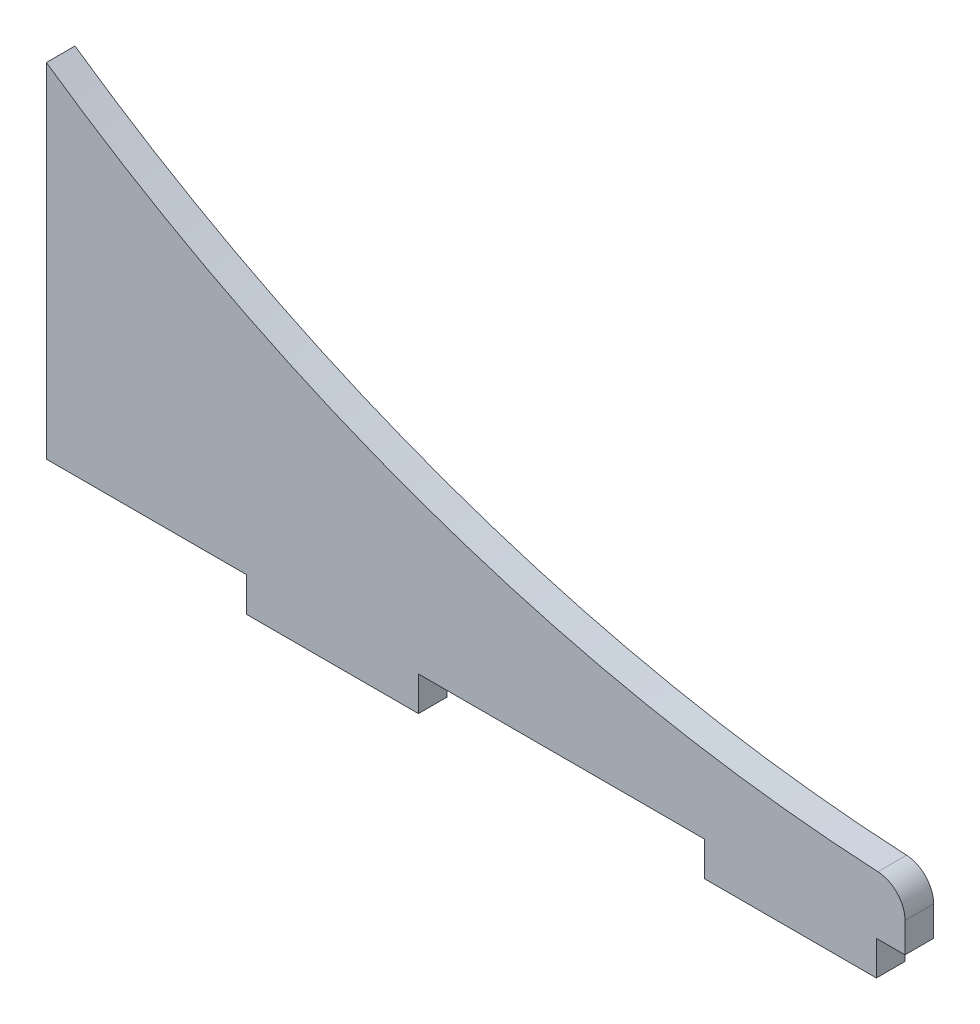
ISO-10303-21;
HEADER;
FILE_DESCRIPTION(('STEP AP214'),'2;1');
FILE_NAME('part.step','',(''),(''),'','','');
FILE_SCHEMA(('AUTOMOTIVE_DESIGN { 1 0 10303 214 1 1 1 1 }'));
ENDSEC;
DATA;
#1=APPLICATION_CONTEXT('core data for automotive mechanical design processes');
#2=APPLICATION_PROTOCOL_DEFINITION('international standard','automotive_design',2000,#1);
#3=PRODUCT_CONTEXT('',#1,'mechanical');
#4=PRODUCT('Part','Part','',(#3));
#5=PRODUCT_RELATED_PRODUCT_CATEGORY('part','',(#4));
#6=PRODUCT_DEFINITION_FORMATION('','',#4);
#7=PRODUCT_DEFINITION_CONTEXT('part definition',#1,'design');
#8=PRODUCT_DEFINITION('design','',#6,#7);
#9=PRODUCT_DEFINITION_SHAPE('','',#8);
#10=(LENGTH_UNIT() NAMED_UNIT(*) SI_UNIT(.MILLI.,.METRE.));
#11=(NAMED_UNIT(*) PLANE_ANGLE_UNIT() SI_UNIT($,.RADIAN.));
#12=(NAMED_UNIT(*) SI_UNIT($,.STERADIAN.) SOLID_ANGLE_UNIT());
#13=UNCERTAINTY_MEASURE_WITH_UNIT(LENGTH_MEASURE(1.E-05),#10,'distance_accuracy_value','');
#14=(GEOMETRIC_REPRESENTATION_CONTEXT(3) GLOBAL_UNCERTAINTY_ASSIGNED_CONTEXT((#13)) GLOBAL_UNIT_ASSIGNED_CONTEXT((#10,
#11,#12)) REPRESENTATION_CONTEXT('',''));
#15=CARTESIAN_POINT('',(0.,0.,0.));
#16=DIRECTION('',(0.,0.,1.));
#17=DIRECTION('',(1.,0.,0.));
#18=AXIS2_PLACEMENT_3D('',#15,#16,#17);
#19=CARTESIAN_POINT('',(15.,0.,5.));
#20=DIRECTION('',(0.,1.,0.));
#21=DIRECTION('',(-1.,0.,0.));
#22=AXIS2_PLACEMENT_3D('',#19,#20,#21);
#23=PLANE('',#22);
#24=DIRECTION('',(1.,0.,0.));
#25=VECTOR('',#24,1.);
#26=CARTESIAN_POINT('',(15.,0.,0.));
#27=LINE('',#26,#25);
#28=CARTESIAN_POINT('',(-20.,0.,0.));
#29=VERTEX_POINT('',#28);
#30=CARTESIAN_POINT('',(15.,0.,0.));
#31=VERTEX_POINT('',#30);
#32=EDGE_CURVE('E156',#29,#31,#27,.T.);
#33=ORIENTED_EDGE('',*,*,#32,.T.);
#34=DIRECTION('',(0.,0.,-1.));
#35=VECTOR('',#34,1.);
#36=CARTESIAN_POINT('',(15.,0.,5.));
#37=LINE('',#36,#35);
#38=CARTESIAN_POINT('',(15.,0.,5.));
#39=VERTEX_POINT('',#38);
#40=EDGE_CURVE('E155',#39,#31,#37,.T.);
#41=ORIENTED_EDGE('',*,*,#40,.F.);
#42=DIRECTION('',(1.,0.,0.));
#43=VECTOR('',#42,1.);
#44=CARTESIAN_POINT('',(0.,0.,5.));
#45=LINE('',#44,#43);
#46=CARTESIAN_POINT('',(-20.,0.,5.));
#47=VERTEX_POINT('',#46);
#48=EDGE_CURVE('E140',#47,#39,#45,.T.);
#49=ORIENTED_EDGE('',*,*,#48,.F.);
#50=DIRECTION('',(0.,0.,-1.));
#51=VECTOR('',#50,1.);
#52=CARTESIAN_POINT('',(-20.,0.,5.));
#53=LINE('',#52,#51);
#54=EDGE_CURVE('E198',#47,#29,#53,.T.);
#55=ORIENTED_EDGE('',*,*,#54,.T.);
#56=EDGE_LOOP('',(#33,#41,#49,#55));
#57=FACE_BOUND('',#56,.T.);
#58=ADVANCED_FACE('F45',(#57),#23,.F.);
#59=CARTESIAN_POINT('',(15.,-6.,5.));
#60=DIRECTION('',(1.,0.,0.));
#61=DIRECTION('',(0.,0.,-1.));
#62=AXIS2_PLACEMENT_3D('',#59,#60,#61);
#63=PLANE('',#62);
#64=DIRECTION('',(0.,-1.,0.));
#65=VECTOR('',#64,1.);
#66=CARTESIAN_POINT('',(15.,-6.,0.));
#67=LINE('',#66,#65);
#68=CARTESIAN_POINT('',(15.,-6.,0.));
#69=VERTEX_POINT('',#68);
#70=EDGE_CURVE('E201',#31,#69,#67,.T.);
#71=ORIENTED_EDGE('',*,*,#70,.T.);
#72=DIRECTION('',(0.,0.,-1.));
#73=VECTOR('',#72,1.);
#74=CARTESIAN_POINT('',(15.,-6.,5.));
#75=LINE('',#74,#73);
#76=CARTESIAN_POINT('',(15.,-6.,5.));
#77=VERTEX_POINT('',#76);
#78=EDGE_CURVE('E161',#77,#69,#75,.T.);
#79=ORIENTED_EDGE('',*,*,#78,.F.);
#80=DIRECTION('',(0.,-1.,0.));
#81=VECTOR('',#80,1.);
#82=CARTESIAN_POINT('',(15.,-6.,5.));
#83=LINE('',#82,#81);
#84=EDGE_CURVE('E144',#39,#77,#83,.T.);
#85=ORIENTED_EDGE('',*,*,#84,.F.);
#86=ORIENTED_EDGE('',*,*,#40,.T.);
#87=EDGE_LOOP('',(#71,#79,#85,#86));
#88=FACE_BOUND('',#87,.T.);
#89=ADVANCED_FACE('F163',(#88),#63,.F.);
#90=CARTESIAN_POINT('',(45.,-6.,5.));
#91=DIRECTION('',(0.,1.,0.));
#92=DIRECTION('',(-1.,0.,0.));
#93=AXIS2_PLACEMENT_3D('',#90,#91,#92);
#94=PLANE('',#93);
#95=DIRECTION('',(1.,0.,0.));
#96=VECTOR('',#95,1.);
#97=CARTESIAN_POINT('',(45.,-6.,0.));
#98=LINE('',#97,#96);
#99=CARTESIAN_POINT('',(45.,-6.,0.));
#100=VERTEX_POINT('',#99);
#101=EDGE_CURVE('E204',#69,#100,#98,.T.);
#102=ORIENTED_EDGE('',*,*,#101,.T.);
#103=DIRECTION('',(0.,0.,-1.));
#104=VECTOR('',#103,1.);
#105=CARTESIAN_POINT('',(45.,-6.,5.));
#106=LINE('',#105,#104);
#107=CARTESIAN_POINT('',(45.,-6.,5.));
#108=VERTEX_POINT('',#107);
#109=EDGE_CURVE('E264',#108,#100,#106,.T.);
#110=ORIENTED_EDGE('',*,*,#109,.F.);
#111=DIRECTION('',(1.,0.,0.));
#112=VECTOR('',#111,1.);
#113=CARTESIAN_POINT('',(45.,-6.,5.));
#114=LINE('',#113,#112);
#115=EDGE_CURVE('E167',#77,#108,#114,.T.);
#116=ORIENTED_EDGE('',*,*,#115,.F.);
#117=ORIENTED_EDGE('',*,*,#78,.T.);
#118=EDGE_LOOP('',(#102,#110,#116,#117));
#119=FACE_BOUND('',#118,.T.);
#120=ADVANCED_FACE('F302',(#119),#94,.F.);
#121=CARTESIAN_POINT('',(45.,0.,5.));
#122=DIRECTION('',(-1.,0.,0.));
#123=DIRECTION('',(0.,0.,1.));
#124=AXIS2_PLACEMENT_3D('',#121,#122,#123);
#125=PLANE('',#124);
#126=DIRECTION('',(0.,1.,0.));
#127=VECTOR('',#126,1.);
#128=CARTESIAN_POINT('',(45.,0.,0.));
#129=LINE('',#128,#127);
#130=CARTESIAN_POINT('',(45.,0.,0.));
#131=VERTEX_POINT('',#130);
#132=EDGE_CURVE('E207',#100,#131,#129,.T.);
#133=ORIENTED_EDGE('',*,*,#132,.T.);
#134=DIRECTION('',(0.,0.,-1.));
#135=VECTOR('',#134,1.);
#136=CARTESIAN_POINT('',(45.,0.,5.));
#137=LINE('',#136,#135);
#138=CARTESIAN_POINT('',(45.,0.,5.));
#139=VERTEX_POINT('',#138);
#140=EDGE_CURVE('E260',#139,#131,#137,.T.);
#141=ORIENTED_EDGE('',*,*,#140,.F.);
#142=DIRECTION('',(0.,1.,0.));
#143=VECTOR('',#142,1.);
#144=CARTESIAN_POINT('',(45.,0.,5.));
#145=LINE('',#144,#143);
#146=EDGE_CURVE('E170',#108,#139,#145,.T.);
#147=ORIENTED_EDGE('',*,*,#146,.F.);
#148=ORIENTED_EDGE('',*,*,#109,.T.);
#149=EDGE_LOOP('',(#133,#141,#147,#148));
#150=FACE_BOUND('',#149,.T.);
#151=ADVANCED_FACE('F307',(#150),#125,.F.);
#152=CARTESIAN_POINT('',(95.,0.,5.));
#153=DIRECTION('',(0.,1.,0.));
#154=DIRECTION('',(-1.,0.,0.));
#155=AXIS2_PLACEMENT_3D('',#152,#153,#154);
#156=PLANE('',#155);
#157=DIRECTION('',(1.,0.,0.));
#158=VECTOR('',#157,1.);
#159=CARTESIAN_POINT('',(95.,0.,0.));
#160=LINE('',#159,#158);
#161=CARTESIAN_POINT('',(95.,0.,0.));
#162=VERTEX_POINT('',#161);
#163=EDGE_CURVE('E210',#131,#162,#160,.T.);
#164=ORIENTED_EDGE('',*,*,#163,.T.);
#165=DIRECTION('',(0.,0.,-1.));
#166=VECTOR('',#165,1.);
#167=CARTESIAN_POINT('',(95.,0.,5.));
#168=LINE('',#167,#166);
#169=CARTESIAN_POINT('',(95.,0.,5.));
#170=VERTEX_POINT('',#169);
#171=EDGE_CURVE('E256',#170,#162,#168,.T.);
#172=ORIENTED_EDGE('',*,*,#171,.F.);
#173=DIRECTION('',(1.,0.,0.));
#174=VECTOR('',#173,1.);
#175=CARTESIAN_POINT('',(95.,0.,5.));
#176=LINE('',#175,#174);
#177=EDGE_CURVE('E175',#139,#170,#176,.T.);
#178=ORIENTED_EDGE('',*,*,#177,.F.);
#179=ORIENTED_EDGE('',*,*,#140,.T.);
#180=EDGE_LOOP('',(#164,#172,#178,#179));
#181=FACE_BOUND('',#180,.T.);
#182=ADVANCED_FACE('F311',(#181),#156,.F.);
#183=CARTESIAN_POINT('',(95.,-6.,5.));
#184=DIRECTION('',(1.,0.,0.));
#185=DIRECTION('',(0.,0.,-1.));
#186=AXIS2_PLACEMENT_3D('',#183,#184,#185);
#187=PLANE('',#186);
#188=DIRECTION('',(0.,-1.,0.));
#189=VECTOR('',#188,1.);
#190=CARTESIAN_POINT('',(95.,-6.,0.));
#191=LINE('',#190,#189);
#192=CARTESIAN_POINT('',(95.,-6.,0.));
#193=VERTEX_POINT('',#192);
#194=EDGE_CURVE('E213',#162,#193,#191,.T.);
#195=ORIENTED_EDGE('',*,*,#194,.T.);
#196=DIRECTION('',(0.,0.,-1.));
#197=VECTOR('',#196,1.);
#198=CARTESIAN_POINT('',(95.,-6.,5.));
#199=LINE('',#198,#197);
#200=CARTESIAN_POINT('',(95.,-6.,5.));
#201=VERTEX_POINT('',#200);
#202=EDGE_CURVE('E252',#201,#193,#199,.T.);
#203=ORIENTED_EDGE('',*,*,#202,.F.);
#204=DIRECTION('',(0.,-1.,0.));
#205=VECTOR('',#204,1.);
#206=CARTESIAN_POINT('',(95.,-6.,5.));
#207=LINE('',#206,#205);
#208=EDGE_CURVE('E178',#170,#201,#207,.T.);
#209=ORIENTED_EDGE('',*,*,#208,.F.);
#210=ORIENTED_EDGE('',*,*,#171,.T.);
#211=EDGE_LOOP('',(#195,#203,#209,#210));
#212=FACE_BOUND('',#211,.T.);
#213=ADVANCED_FACE('F315',(#212),#187,.F.);
#214=CARTESIAN_POINT('',(125.,-6.,5.));
#215=DIRECTION('',(0.,1.,0.));
#216=DIRECTION('',(-1.,0.,0.));
#217=AXIS2_PLACEMENT_3D('',#214,#215,#216);
#218=PLANE('',#217);
#219=DIRECTION('',(1.,0.,0.));
#220=VECTOR('',#219,1.);
#221=CARTESIAN_POINT('',(125.,-6.,0.));
#222=LINE('',#221,#220);
#223=CARTESIAN_POINT('',(125.,-6.,0.));
#224=VERTEX_POINT('',#223);
#225=EDGE_CURVE('E216',#193,#224,#222,.T.);
#226=ORIENTED_EDGE('',*,*,#225,.T.);
#227=DIRECTION('',(0.,0.,-1.));
#228=VECTOR('',#227,1.);
#229=CARTESIAN_POINT('',(125.,-6.,5.));
#230=LINE('',#229,#228);
#231=CARTESIAN_POINT('',(125.,-6.,5.));
#232=VERTEX_POINT('',#231);
#233=EDGE_CURVE('E248',#232,#224,#230,.T.);
#234=ORIENTED_EDGE('',*,*,#233,.F.);
#235=DIRECTION('',(1.,0.,0.));
#236=VECTOR('',#235,1.);
#237=CARTESIAN_POINT('',(125.,-6.,5.));
#238=LINE('',#237,#236);
#239=EDGE_CURVE('E181',#201,#232,#238,.T.);
#240=ORIENTED_EDGE('',*,*,#239,.F.);
#241=ORIENTED_EDGE('',*,*,#202,.T.);
#242=EDGE_LOOP('',(#226,#234,#240,#241));
#243=FACE_BOUND('',#242,.T.);
#244=ADVANCED_FACE('F319',(#243),#218,.F.);
#245=CARTESIAN_POINT('',(125.,0.,5.));
#246=DIRECTION('',(-1.,0.,0.));
#247=DIRECTION('',(0.,0.,1.));
#248=AXIS2_PLACEMENT_3D('',#245,#246,#247);
#249=PLANE('',#248);
#250=DIRECTION('',(0.,1.,0.));
#251=VECTOR('',#250,1.);
#252=CARTESIAN_POINT('',(125.,0.,0.));
#253=LINE('',#252,#251);
#254=CARTESIAN_POINT('',(125.,0.,0.));
#255=VERTEX_POINT('',#254);
#256=EDGE_CURVE('E219',#224,#255,#253,.T.);
#257=ORIENTED_EDGE('',*,*,#256,.T.);
#258=DIRECTION('',(0.,0.,-1.));
#259=VECTOR('',#258,1.);
#260=CARTESIAN_POINT('',(125.,0.,5.));
#261=LINE('',#260,#259);
#262=CARTESIAN_POINT('',(125.,0.,5.));
#263=VERTEX_POINT('',#262);
#264=EDGE_CURVE('E244',#263,#255,#261,.T.);
#265=ORIENTED_EDGE('',*,*,#264,.F.);
#266=DIRECTION('',(0.,1.,0.));
#267=VECTOR('',#266,1.);
#268=CARTESIAN_POINT('',(125.,0.,5.));
#269=LINE('',#268,#267);
#270=EDGE_CURVE('E184',#232,#263,#269,.T.);
#271=ORIENTED_EDGE('',*,*,#270,.F.);
#272=ORIENTED_EDGE('',*,*,#233,.T.);
#273=EDGE_LOOP('',(#257,#265,#271,#272));
#274=FACE_BOUND('',#273,.T.);
#275=ADVANCED_FACE('F323',(#274),#249,.F.);
#276=CARTESIAN_POINT('',(125.,0.,5.));
#277=DIRECTION('',(0.,1.,0.));
#278=DIRECTION('',(-1.,0.,0.));
#279=AXIS2_PLACEMENT_3D('',#276,#277,#278);
#280=PLANE('',#279);
#281=DIRECTION('',(1.,0.,0.));
#282=VECTOR('',#281,1.);
#283=CARTESIAN_POINT('',(125.,0.,0.));
#284=LINE('',#283,#282);
#285=CARTESIAN_POINT('',(130.,0.,0.));
#286=VERTEX_POINT('',#285);
#287=EDGE_CURVE('E222',#255,#286,#284,.T.);
#288=ORIENTED_EDGE('',*,*,#287,.T.);
#289=DIRECTION('',(0.,0.,-1.));
#290=VECTOR('',#289,1.);
#291=CARTESIAN_POINT('',(130.,0.,5.));
#292=LINE('',#291,#290);
#293=CARTESIAN_POINT('',(130.,0.,5.));
#294=VERTEX_POINT('',#293);
#295=EDGE_CURVE('E240',#294,#286,#292,.T.);
#296=ORIENTED_EDGE('',*,*,#295,.F.);
#297=DIRECTION('',(1.,0.,0.));
#298=VECTOR('',#297,1.);
#299=CARTESIAN_POINT('',(125.,0.,5.));
#300=LINE('',#299,#298);
#301=EDGE_CURVE('E187',#263,#294,#300,.T.);
#302=ORIENTED_EDGE('',*,*,#301,.F.);
#303=ORIENTED_EDGE('',*,*,#264,.T.);
#304=EDGE_LOOP('',(#288,#296,#302,#303));
#305=FACE_BOUND('',#304,.T.);
#306=ADVANCED_FACE('F327',(#305),#280,.F.);
#307=CARTESIAN_POINT('',(130.,10.,5.));
#308=DIRECTION('',(-1.,0.,0.));
#309=DIRECTION('',(0.,0.,1.));
#310=AXIS2_PLACEMENT_3D('',#307,#308,#309);
#311=PLANE('',#310);
#312=DIRECTION('',(0.,1.,0.));
#313=VECTOR('',#312,1.);
#314=CARTESIAN_POINT('',(130.,10.,0.));
#315=LINE('',#314,#313);
#316=CARTESIAN_POINT('',(130.,5.21538364611845,0.));
#317=VERTEX_POINT('',#316);
#318=EDGE_CURVE('E225',#286,#317,#315,.T.);
#319=ORIENTED_EDGE('',*,*,#318,.T.);
#320=DIRECTION('',(0.,0.,-1.));
#321=VECTOR('',#320,1.);
#322=CARTESIAN_POINT('',(130.,5.21538364611845,5.));
#323=LINE('',#322,#321);
#324=CARTESIAN_POINT('',(130.,5.21538364611845,5.));
#325=VERTEX_POINT('',#324);
#326=EDGE_CURVE('E54',#317,#325,#323,.F.);
#327=ORIENTED_EDGE('',*,*,#326,.T.);
#328=DIRECTION('',(0.,1.,0.));
#329=VECTOR('',#328,1.);
#330=CARTESIAN_POINT('',(130.,10.,5.));
#331=LINE('',#330,#329);
#332=EDGE_CURVE('E190',#294,#325,#331,.T.);
#333=ORIENTED_EDGE('',*,*,#332,.F.);
#334=ORIENTED_EDGE('',*,*,#295,.T.);
#335=EDGE_LOOP('',(#319,#327,#333,#334));
#336=FACE_BOUND('',#335,.T.);
#337=ADVANCED_FACE('F295',(#336),#311,.F.);
#338=CARTESIAN_POINT('',(139.941156102328,289.823468306983,5.));
#339=DIRECTION('',(0.,0.,-1.));
#340=DIRECTION('',(-1.,0.,0.));
#341=AXIS2_PLACEMENT_3D('',#338,#339,#340);
#342=CYLINDRICAL_SURFACE('',#341,280.);
#343=CARTESIAN_POINT('',(139.941156102328,289.823468306983,5.));
#344=DIRECTION('',(0.,0.,-1.));
#345=DIRECTION('',(-1.,0.,0.));
#346=AXIS2_PLACEMENT_3D('',#343,#344,#345);
#347=CIRCLE('',#346,280.);
#348=CARTESIAN_POINT('',(125.262125545655,10.2085079384143,5.));
#349=VERTEX_POINT('',#348);
#350=CARTESIAN_POINT('',(-20.,60.,5.));
#351=VERTEX_POINT('',#350);
#352=EDGE_CURVE('E193',#349,#351,#347,.T.);
#353=ORIENTED_EDGE('',*,*,#352,.F.);
#354=DIRECTION('',(0.,0.,-1.));
#355=VECTOR('',#354,1.);
#356=CARTESIAN_POINT('',(125.262125545655,10.2085079384143,5.));
#357=LINE('',#356,#355);
#358=CARTESIAN_POINT('',(125.262125545655,10.2085079384143,0.));
#359=VERTEX_POINT('',#358);
#360=EDGE_CURVE('E160',#349,#359,#357,.T.);
#361=ORIENTED_EDGE('',*,*,#360,.T.);
#362=CARTESIAN_POINT('',(139.941156102328,289.823468306983,0.));
#363=DIRECTION('',(0.,0.,-1.));
#364=DIRECTION('',(-1.,0.,0.));
#365=AXIS2_PLACEMENT_3D('',#362,#363,#364);
#366=CIRCLE('',#365,280.);
#367=CARTESIAN_POINT('',(-20.,60.,0.));
#368=VERTEX_POINT('',#367);
#369=EDGE_CURVE('E228',#359,#368,#366,.T.);
#370=ORIENTED_EDGE('',*,*,#369,.T.);
#371=DIRECTION('',(0.,0.,-1.));
#372=VECTOR('',#371,1.);
#373=CARTESIAN_POINT('',(-20.,60.,5.));
#374=LINE('',#373,#372);
#375=EDGE_CURVE('E236',#351,#368,#374,.T.);
#376=ORIENTED_EDGE('',*,*,#375,.F.);
#377=EDGE_LOOP('',(#353,#361,#370,#376));
#378=FACE_BOUND('',#377,.T.);
#379=ADVANCED_FACE('F278',(#378),#342,.F.);
#380=CARTESIAN_POINT('',(-20.,0.,5.));
#381=DIRECTION('',(1.,0.,0.));
#382=DIRECTION('',(0.,0.,-1.));
#383=AXIS2_PLACEMENT_3D('',#380,#381,#382);
#384=PLANE('',#383);
#385=DIRECTION('',(0.,-1.,0.));
#386=VECTOR('',#385,1.);
#387=CARTESIAN_POINT('',(-20.,0.,0.));
#388=LINE('',#387,#386);
#389=EDGE_CURVE('E152',#368,#29,#388,.T.);
#390=ORIENTED_EDGE('',*,*,#389,.T.);
#391=ORIENTED_EDGE('',*,*,#54,.F.);
#392=DIRECTION('',(0.,-1.,0.));
#393=VECTOR('',#392,1.);
#394=CARTESIAN_POINT('',(-20.,0.,5.));
#395=LINE('',#394,#393);
#396=EDGE_CURVE('E147',#351,#47,#395,.T.);
#397=ORIENTED_EDGE('',*,*,#396,.F.);
#398=ORIENTED_EDGE('',*,*,#375,.T.);
#399=EDGE_LOOP('',(#390,#391,#397,#398));
#400=FACE_BOUND('',#399,.T.);
#401=ADVANCED_FACE('F285',(#400),#384,.F.);
#402=CARTESIAN_POINT('',(139.941156102328,289.823468306983,5.));
#403=DIRECTION('',(0.,0.,-1.));
#404=DIRECTION('',(-1.,0.,0.));
#405=AXIS2_PLACEMENT_3D('',#402,#403,#404);
#406=PLANE('',#405);
#407=ORIENTED_EDGE('',*,*,#332,.T.);
#408=CARTESIAN_POINT('',(125.,5.21538364611845,5.));
#409=DIRECTION('',(0.,0.,-1.));
#410=DIRECTION('',(-1.,0.,0.));
#411=AXIS2_PLACEMENT_3D('',#408,#409,#410);
#412=CIRCLE('',#411,5.);
#413=EDGE_CURVE('E11',#325,#349,#412,.F.);
#414=ORIENTED_EDGE('',*,*,#413,.T.);
#415=ORIENTED_EDGE('',*,*,#352,.T.);
#416=ORIENTED_EDGE('',*,*,#396,.T.);
#417=ORIENTED_EDGE('',*,*,#48,.T.);
#418=ORIENTED_EDGE('',*,*,#84,.T.);
#419=ORIENTED_EDGE('',*,*,#115,.T.);
#420=ORIENTED_EDGE('',*,*,#146,.T.);
#421=ORIENTED_EDGE('',*,*,#177,.T.);
#422=ORIENTED_EDGE('',*,*,#208,.T.);
#423=ORIENTED_EDGE('',*,*,#239,.T.);
#424=ORIENTED_EDGE('',*,*,#270,.T.);
#425=ORIENTED_EDGE('',*,*,#301,.T.);
#426=EDGE_LOOP('',(#407,#414,#415,#416,#417,#418,#419,#420,#421,#422,#423,#424,#425));
#427=FACE_BOUND('',#426,.T.);
#428=ADVANCED_FACE('F142',(#427),#406,.F.);
#429=CARTESIAN_POINT('',(139.941156102328,289.823468306983,0.));
#430=DIRECTION('',(0.,0.,-1.));
#431=DIRECTION('',(-1.,0.,0.));
#432=AXIS2_PLACEMENT_3D('',#429,#430,#431);
#433=PLANE('',#432);
#434=ORIENTED_EDGE('',*,*,#369,.F.);
#435=CARTESIAN_POINT('',(125.,5.21538364611845,0.));
#436=DIRECTION('',(0.,0.,-1.));
#437=DIRECTION('',(-1.,0.,0.));
#438=AXIS2_PLACEMENT_3D('',#435,#436,#437);
#439=CIRCLE('',#438,5.);
#440=EDGE_CURVE('E68',#359,#317,#439,.T.);
#441=ORIENTED_EDGE('',*,*,#440,.T.);
#442=ORIENTED_EDGE('',*,*,#318,.F.);
#443=ORIENTED_EDGE('',*,*,#287,.F.);
#444=ORIENTED_EDGE('',*,*,#256,.F.);
#445=ORIENTED_EDGE('',*,*,#225,.F.);
#446=ORIENTED_EDGE('',*,*,#194,.F.);
#447=ORIENTED_EDGE('',*,*,#163,.F.);
#448=ORIENTED_EDGE('',*,*,#132,.F.);
#449=ORIENTED_EDGE('',*,*,#101,.F.);
#450=ORIENTED_EDGE('',*,*,#70,.F.);
#451=ORIENTED_EDGE('',*,*,#32,.F.);
#452=ORIENTED_EDGE('',*,*,#389,.F.);
#453=EDGE_LOOP('',(#434,#441,#442,#443,#444,#445,#446,#447,#448,#449,#450,#451,#452));
#454=FACE_BOUND('',#453,.T.);
#455=ADVANCED_FACE('F283',(#454),#433,.T.);
#456=CARTESIAN_POINT('',(125.,5.21538364611845,5.));
#457=DIRECTION('',(0.,0.,-1.));
#458=DIRECTION('',(-1.,0.,0.));
#459=AXIS2_PLACEMENT_3D('',#456,#457,#458);
#460=CYLINDRICAL_SURFACE('',#459,5.);
#461=ORIENTED_EDGE('',*,*,#413,.F.);
#462=ORIENTED_EDGE('',*,*,#326,.F.);
#463=ORIENTED_EDGE('',*,*,#440,.F.);
#464=ORIENTED_EDGE('',*,*,#360,.F.);
#465=EDGE_LOOP('',(#461,#462,#463,#464));
#466=FACE_BOUND('',#465,.T.);
#467=ADVANCED_FACE('F47',(#466),#460,.T.);
#468=CLOSED_SHELL('',(#58,#89,#120,#151,#182,#213,#244,#275,#306,#337,#379,#401,#428,#455,#467));
#469=MANIFOLD_SOLID_BREP('B2',#468);
#470=ADVANCED_BREP_SHAPE_REPRESENTATION('',(#18,#469),#14);
#471=SHAPE_DEFINITION_REPRESENTATION(#9,#470);
ENDSEC;
END-ISO-10303-21;
